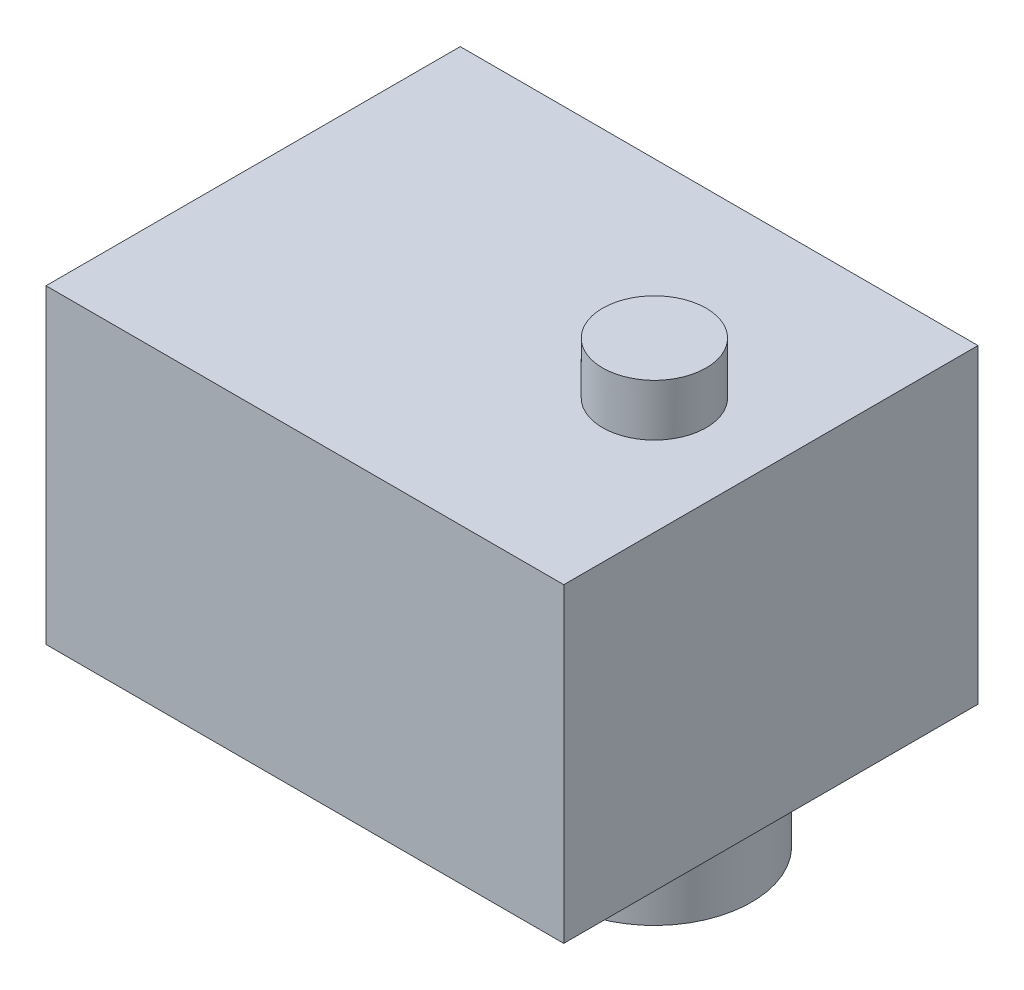
ISO-10303-21;
HEADER;
FILE_DESCRIPTION(('STEP AP214'),'2;1');
FILE_NAME('part.step','',(''),(''),'','','');
FILE_SCHEMA(('AUTOMOTIVE_DESIGN { 1 0 10303 214 1 1 1 1 }'));
ENDSEC;
DATA;
#1=APPLICATION_CONTEXT('core data for automotive mechanical design processes');
#2=APPLICATION_PROTOCOL_DEFINITION('international standard','automotive_design',2000,#1);
#3=PRODUCT_CONTEXT('',#1,'mechanical');
#4=PRODUCT('Part','Part','',(#3));
#5=PRODUCT_RELATED_PRODUCT_CATEGORY('part','',(#4));
#6=PRODUCT_DEFINITION_FORMATION('','',#4);
#7=PRODUCT_DEFINITION_CONTEXT('part definition',#1,'design');
#8=PRODUCT_DEFINITION('design','',#6,#7);
#9=PRODUCT_DEFINITION_SHAPE('','',#8);
#10=(LENGTH_UNIT() NAMED_UNIT(*) SI_UNIT(.MILLI.,.METRE.));
#11=(NAMED_UNIT(*) PLANE_ANGLE_UNIT() SI_UNIT($,.RADIAN.));
#12=(NAMED_UNIT(*) SI_UNIT($,.STERADIAN.) SOLID_ANGLE_UNIT());
#13=UNCERTAINTY_MEASURE_WITH_UNIT(LENGTH_MEASURE(1.E-05),#10,'distance_accuracy_value','');
#14=(GEOMETRIC_REPRESENTATION_CONTEXT(3) GLOBAL_UNCERTAINTY_ASSIGNED_CONTEXT((#13)) GLOBAL_UNIT_ASSIGNED_CONTEXT((#10,
#11,#12)) REPRESENTATION_CONTEXT('',''));
#15=CARTESIAN_POINT('',(0.,0.,0.));
#16=DIRECTION('',(0.,0.,1.));
#17=DIRECTION('',(1.,0.,0.));
#18=AXIS2_PLACEMENT_3D('',#15,#16,#17);
#19=CARTESIAN_POINT('',(0.,12.,0.));
#20=DIRECTION('',(1.,0.,0.));
#21=DIRECTION('',(0.,0.,-1.));
#22=AXIS2_PLACEMENT_3D('',#19,#20,#21);
#23=PLANE('',#22);
#24=DIRECTION('',(0.,0.,1.));
#25=VECTOR('',#24,1.);
#26=CARTESIAN_POINT('',(0.,0.,0.));
#27=LINE('',#26,#25);
#28=CARTESIAN_POINT('',(0.,0.,-16.));
#29=VERTEX_POINT('',#28);
#30=CARTESIAN_POINT('',(0.,0.,0.));
#31=VERTEX_POINT('',#30);
#32=EDGE_CURVE('E114',#29,#31,#27,.T.);
#33=ORIENTED_EDGE('',*,*,#32,.T.);
#34=DIRECTION('',(0.,-1.,0.));
#35=VECTOR('',#34,1.);
#36=CARTESIAN_POINT('',(0.,12.,0.));
#37=LINE('',#36,#35);
#38=CARTESIAN_POINT('',(0.,12.,0.));
#39=VERTEX_POINT('',#38);
#40=EDGE_CURVE('E102',#39,#31,#37,.T.);
#41=ORIENTED_EDGE('',*,*,#40,.F.);
#42=DIRECTION('',(0.,0.,1.));
#43=VECTOR('',#42,1.);
#44=CARTESIAN_POINT('',(0.,12.,0.));
#45=LINE('',#44,#43);
#46=CARTESIAN_POINT('',(0.,12.,-16.));
#47=VERTEX_POINT('',#46);
#48=EDGE_CURVE('E94',#47,#39,#45,.T.);
#49=ORIENTED_EDGE('',*,*,#48,.F.);
#50=DIRECTION('',(0.,-1.,0.));
#51=VECTOR('',#50,1.);
#52=CARTESIAN_POINT('',(0.,12.,-16.));
#53=LINE('',#52,#51);
#54=EDGE_CURVE('E110',#47,#29,#53,.T.);
#55=ORIENTED_EDGE('',*,*,#54,.T.);
#56=EDGE_LOOP('',(#33,#41,#49,#55));
#57=FACE_BOUND('',#56,.T.);
#58=ADVANCED_FACE('F40',(#57),#23,.F.);
#59=CARTESIAN_POINT('',(0.,12.,0.));
#60=DIRECTION('',(0.,0.,-1.));
#61=DIRECTION('',(-1.,0.,0.));
#62=AXIS2_PLACEMENT_3D('',#59,#60,#61);
#63=PLANE('',#62);
#64=DIRECTION('',(1.,0.,0.));
#65=VECTOR('',#64,1.);
#66=CARTESIAN_POINT('',(0.,0.,0.));
#67=LINE('',#66,#65);
#68=CARTESIAN_POINT('',(20.,0.,0.));
#69=VERTEX_POINT('',#68);
#70=EDGE_CURVE('E100',#31,#69,#67,.T.);
#71=ORIENTED_EDGE('',*,*,#70,.T.);
#72=DIRECTION('',(0.,-1.,0.));
#73=VECTOR('',#72,1.);
#74=CARTESIAN_POINT('',(20.,12.,0.));
#75=LINE('',#74,#73);
#76=CARTESIAN_POINT('',(20.,12.,0.));
#77=VERTEX_POINT('',#76);
#78=EDGE_CURVE('E98',#77,#69,#75,.T.);
#79=ORIENTED_EDGE('',*,*,#78,.F.);
#80=DIRECTION('',(1.,0.,0.));
#81=VECTOR('',#80,1.);
#82=CARTESIAN_POINT('',(0.,12.,0.));
#83=LINE('',#82,#81);
#84=EDGE_CURVE('E89',#39,#77,#83,.T.);
#85=ORIENTED_EDGE('',*,*,#84,.F.);
#86=ORIENTED_EDGE('',*,*,#40,.T.);
#87=EDGE_LOOP('',(#71,#79,#85,#86));
#88=FACE_BOUND('',#87,.T.);
#89=ADVANCED_FACE('F99',(#88),#63,.F.);
#90=CARTESIAN_POINT('',(20.,12.,0.));
#91=DIRECTION('',(-1.,0.,0.));
#92=DIRECTION('',(0.,0.,1.));
#93=AXIS2_PLACEMENT_3D('',#90,#91,#92);
#94=PLANE('',#93);
#95=DIRECTION('',(0.,0.,-1.));
#96=VECTOR('',#95,1.);
#97=CARTESIAN_POINT('',(20.,0.,0.));
#98=LINE('',#97,#96);
#99=CARTESIAN_POINT('',(20.,0.,-16.));
#100=VERTEX_POINT('',#99);
#101=EDGE_CURVE('E75',#69,#100,#98,.T.);
#102=ORIENTED_EDGE('',*,*,#101,.T.);
#103=DIRECTION('',(0.,-1.,0.));
#104=VECTOR('',#103,1.);
#105=CARTESIAN_POINT('',(20.,12.,-16.));
#106=LINE('',#105,#104);
#107=CARTESIAN_POINT('',(20.,12.,-16.));
#108=VERTEX_POINT('',#107);
#109=EDGE_CURVE('E103',#108,#100,#106,.T.);
#110=ORIENTED_EDGE('',*,*,#109,.F.);
#111=DIRECTION('',(0.,0.,-1.));
#112=VECTOR('',#111,1.);
#113=CARTESIAN_POINT('',(20.,12.,0.));
#114=LINE('',#113,#112);
#115=EDGE_CURVE('E92',#77,#108,#114,.T.);
#116=ORIENTED_EDGE('',*,*,#115,.F.);
#117=ORIENTED_EDGE('',*,*,#78,.T.);
#118=EDGE_LOOP('',(#102,#110,#116,#117));
#119=FACE_BOUND('',#118,.T.);
#120=ADVANCED_FACE('F105',(#119),#94,.F.);
#121=CARTESIAN_POINT('',(0.,12.,-16.));
#122=DIRECTION('',(0.,0.,1.));
#123=DIRECTION('',(1.,0.,0.));
#124=AXIS2_PLACEMENT_3D('',#121,#122,#123);
#125=PLANE('',#124);
#126=DIRECTION('',(-1.,0.,0.));
#127=VECTOR('',#126,1.);
#128=CARTESIAN_POINT('',(0.,0.,-16.));
#129=LINE('',#128,#127);
#130=EDGE_CURVE('E81',#100,#29,#129,.T.);
#131=ORIENTED_EDGE('',*,*,#130,.T.);
#132=ORIENTED_EDGE('',*,*,#54,.F.);
#133=DIRECTION('',(-1.,0.,0.));
#134=VECTOR('',#133,1.);
#135=CARTESIAN_POINT('',(0.,12.,-16.));
#136=LINE('',#135,#134);
#137=EDGE_CURVE('E58',#108,#47,#136,.T.);
#138=ORIENTED_EDGE('',*,*,#137,.F.);
#139=ORIENTED_EDGE('',*,*,#109,.T.);
#140=EDGE_LOOP('',(#131,#132,#138,#139));
#141=FACE_BOUND('',#140,.T.);
#142=ADVANCED_FACE('F137',(#141),#125,.F.);
#143=CARTESIAN_POINT('',(0.,12.,0.));
#144=DIRECTION('',(0.,-1.,0.));
#145=DIRECTION('',(0.,0.,-1.));
#146=AXIS2_PLACEMENT_3D('',#143,#144,#145);
#147=PLANE('',#146);
#148=CARTESIAN_POINT('',(15.5,12.,-8.));
#149=DIRECTION('',(0.,-1.,0.));
#150=DIRECTION('',(0.,0.,-1.));
#151=AXIS2_PLACEMENT_3D('',#148,#149,#150);
#152=CIRCLE('',#151,2.);
#153=CARTESIAN_POINT('',(15.5,12.,-10.));
#154=VERTEX_POINT('',#153);
#155=EDGE_CURVE('E43',#154,#154,#152,.F.);
#156=ORIENTED_EDGE('',*,*,#155,.F.);
#157=EDGE_LOOP('',(#156));
#158=FACE_BOUND('',#157,.T.);
#159=ORIENTED_EDGE('',*,*,#48,.T.);
#160=ORIENTED_EDGE('',*,*,#84,.T.);
#161=ORIENTED_EDGE('',*,*,#115,.T.);
#162=ORIENTED_EDGE('',*,*,#137,.T.);
#163=EDGE_LOOP('',(#159,#160,#161,#162));
#164=FACE_BOUND('',#163,.T.);
#165=ADVANCED_FACE('F90',(#158,#164),#147,.F.);
#166=CARTESIAN_POINT('',(0.,0.,0.));
#167=DIRECTION('',(0.,-1.,0.));
#168=DIRECTION('',(0.,0.,-1.));
#169=AXIS2_PLACEMENT_3D('',#166,#167,#168);
#170=PLANE('',#169);
#171=CARTESIAN_POINT('',(15.5,0.,-8.));
#172=DIRECTION('',(0.,-1.,0.));
#173=DIRECTION('',(0.,0.,-1.));
#174=AXIS2_PLACEMENT_3D('',#171,#172,#173);
#175=CIRCLE('',#174,3.75);
#176=CARTESIAN_POINT('',(15.5,0.,-11.75));
#177=VERTEX_POINT('',#176);
#178=EDGE_CURVE('E159',#177,#177,#175,.T.);
#179=ORIENTED_EDGE('',*,*,#178,.F.);
#180=EDGE_LOOP('',(#179));
#181=FACE_BOUND('',#180,.T.);
#182=ORIENTED_EDGE('',*,*,#32,.F.);
#183=ORIENTED_EDGE('',*,*,#130,.F.);
#184=ORIENTED_EDGE('',*,*,#101,.F.);
#185=ORIENTED_EDGE('',*,*,#70,.F.);
#186=EDGE_LOOP('',(#182,#183,#184,#185));
#187=FACE_BOUND('',#186,.T.);
#188=ADVANCED_FACE('F136',(#181,#187),#170,.T.);
#189=CARTESIAN_POINT('',(15.5,14.,-8.));
#190=DIRECTION('',(0.,-1.,0.));
#191=DIRECTION('',(0.,0.,-1.));
#192=AXIS2_PLACEMENT_3D('',#189,#190,#191);
#193=CYLINDRICAL_SURFACE('',#192,2.);
#194=CARTESIAN_POINT('',(15.5,14.,-8.));
#195=DIRECTION('',(0.,1.,0.));
#196=DIRECTION('',(0.,0.,1.));
#197=AXIS2_PLACEMENT_3D('',#194,#195,#196);
#198=CIRCLE('',#197,2.);
#199=CARTESIAN_POINT('',(15.5,14.,-6.));
#200=VERTEX_POINT('',#199);
#201=EDGE_CURVE('E118',#200,#200,#198,.T.);
#202=ORIENTED_EDGE('',*,*,#201,.F.);
#203=EDGE_LOOP('',(#202));
#204=FACE_BOUND('',#203,.T.);
#205=ORIENTED_EDGE('',*,*,#155,.T.);
#206=EDGE_LOOP('',(#205));
#207=FACE_BOUND('',#206,.T.);
#208=ADVANCED_FACE('F133',(#204,#207),#193,.T.);
#209=CARTESIAN_POINT('',(15.5,14.,-8.));
#210=DIRECTION('',(0.,1.,0.));
#211=DIRECTION('',(0.,0.,1.));
#212=AXIS2_PLACEMENT_3D('',#209,#210,#211);
#213=PLANE('',#212);
#214=ORIENTED_EDGE('',*,*,#201,.T.);
#215=EDGE_LOOP('',(#214));
#216=FACE_BOUND('',#215,.T.);
#217=ADVANCED_FACE('F188',(#216),#213,.T.);
#218=CARTESIAN_POINT('',(15.5,-3.,-8.));
#219=DIRECTION('',(0.,1.,0.));
#220=DIRECTION('',(0.,0.,1.));
#221=AXIS2_PLACEMENT_3D('',#218,#219,#220);
#222=CYLINDRICAL_SURFACE('',#221,3.75);
#223=CARTESIAN_POINT('',(15.5,-3.,-8.));
#224=DIRECTION('',(0.,-1.,0.));
#225=DIRECTION('',(0.,0.,-1.));
#226=AXIS2_PLACEMENT_3D('',#223,#224,#225);
#227=CIRCLE('',#226,3.75);
#228=CARTESIAN_POINT('',(15.5,-3.,-11.75));
#229=VERTEX_POINT('',#228);
#230=EDGE_CURVE('E158',#229,#229,#227,.T.);
#231=ORIENTED_EDGE('',*,*,#230,.F.);
#232=EDGE_LOOP('',(#231));
#233=FACE_BOUND('',#232,.T.);
#234=ORIENTED_EDGE('',*,*,#178,.T.);
#235=EDGE_LOOP('',(#234));
#236=FACE_BOUND('',#235,.T.);
#237=ADVANCED_FACE('F182',(#233,#236),#222,.T.);
#238=CARTESIAN_POINT('',(15.5,-3.,-8.));
#239=DIRECTION('',(0.,-1.,0.));
#240=DIRECTION('',(0.,0.,-1.));
#241=AXIS2_PLACEMENT_3D('',#238,#239,#240);
#242=PLANE('',#241);
#243=CARTESIAN_POINT('',(15.5,-3.,-8.));
#244=DIRECTION('',(0.,-1.,0.));
#245=DIRECTION('',(0.,0.,-1.));
#246=AXIS2_PLACEMENT_3D('',#243,#244,#245);
#247=CIRCLE('',#246,2.);
#248=CARTESIAN_POINT('',(15.5,-3.,-10.));
#249=VERTEX_POINT('',#248);
#250=EDGE_CURVE('E11',#249,#249,#247,.T.);
#251=ORIENTED_EDGE('',*,*,#250,.F.);
#252=EDGE_LOOP('',(#251));
#253=FACE_BOUND('',#252,.T.);
#254=ORIENTED_EDGE('',*,*,#230,.T.);
#255=EDGE_LOOP('',(#254));
#256=FACE_BOUND('',#255,.T.);
#257=ADVANCED_FACE('F176',(#253,#256),#242,.T.);
#258=CARTESIAN_POINT('',(15.5,-3.,-8.));
#259=DIRECTION('',(0.,1.,0.));
#260=DIRECTION('',(0.,0.,-1.));
#261=AXIS2_PLACEMENT_3D('',#258,#259,#260);
#262=CONICAL_SURFACE('',#261,2.,0.5235987755983);
#263=CARTESIAN_POINT('',(15.5,-5.,-8.));
#264=DIRECTION('',(0.,-1.,0.));
#265=DIRECTION('',(0.,0.,-1.));
#266=AXIS2_PLACEMENT_3D('',#263,#264,#265);
#267=CIRCLE('',#266,0.845299461620745);
#268=CARTESIAN_POINT('',(15.5,-5.,-8.84529946162074));
#269=VERTEX_POINT('',#268);
#270=EDGE_CURVE('E163',#269,#269,#267,.T.);
#271=ORIENTED_EDGE('',*,*,#270,.F.);
#272=EDGE_LOOP('',(#271));
#273=FACE_BOUND('',#272,.T.);
#274=ORIENTED_EDGE('',*,*,#250,.T.);
#275=EDGE_LOOP('',(#274));
#276=FACE_BOUND('',#275,.T.);
#277=ADVANCED_FACE('F173',(#273,#276),#262,.T.);
#278=CARTESIAN_POINT('',(15.5,-5.,-8.));
#279=DIRECTION('',(0.,-1.,0.));
#280=DIRECTION('',(0.,0.,-1.));
#281=AXIS2_PLACEMENT_3D('',#278,#279,#280);
#282=PLANE('',#281);
#283=ORIENTED_EDGE('',*,*,#270,.T.);
#284=EDGE_LOOP('',(#283));
#285=FACE_BOUND('',#284,.T.);
#286=ADVANCED_FACE('F171',(#285),#282,.T.);
#287=CLOSED_SHELL('',(#58,#89,#120,#142,#165,#188,#208,#217,#237,#257,#277,#286));
#288=MANIFOLD_SOLID_BREP('B2',#287);
#289=ADVANCED_BREP_SHAPE_REPRESENTATION('',(#18,#288),#14);
#290=SHAPE_DEFINITION_REPRESENTATION(#9,#289);
ENDSEC;
END-ISO-10303-21;
